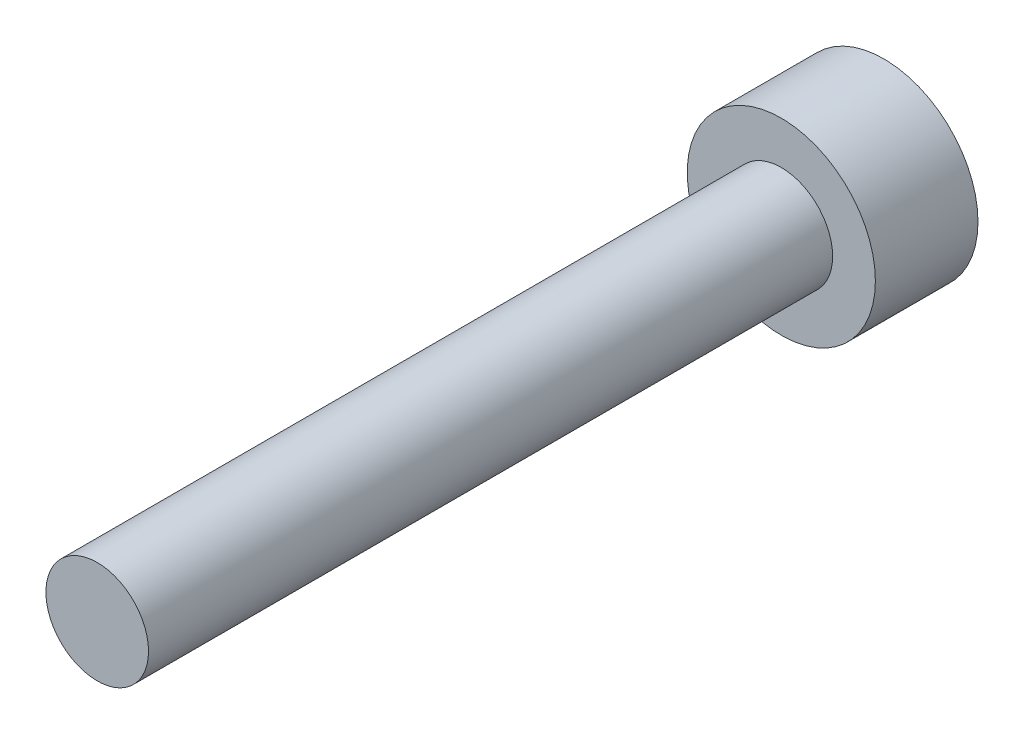
ISO-10303-21;
HEADER;
FILE_DESCRIPTION(('STEP AP214'),'2;1');
FILE_NAME('part.step','',(''),(''),'','','');
FILE_SCHEMA(('AUTOMOTIVE_DESIGN { 1 0 10303 214 1 1 1 1 }'));
ENDSEC;
DATA;
#1=APPLICATION_CONTEXT('core data for automotive mechanical design processes');
#2=APPLICATION_PROTOCOL_DEFINITION('international standard','automotive_design',2000,#1);
#3=PRODUCT_CONTEXT('',#1,'mechanical');
#4=PRODUCT('Part','Part','',(#3));
#5=PRODUCT_RELATED_PRODUCT_CATEGORY('part','',(#4));
#6=PRODUCT_DEFINITION_FORMATION('','',#4);
#7=PRODUCT_DEFINITION_CONTEXT('part definition',#1,'design');
#8=PRODUCT_DEFINITION('design','',#6,#7);
#9=PRODUCT_DEFINITION_SHAPE('','',#8);
#10=(LENGTH_UNIT() NAMED_UNIT(*) SI_UNIT(.MILLI.,.METRE.));
#11=(NAMED_UNIT(*) PLANE_ANGLE_UNIT() SI_UNIT($,.RADIAN.));
#12=(NAMED_UNIT(*) SI_UNIT($,.STERADIAN.) SOLID_ANGLE_UNIT());
#13=UNCERTAINTY_MEASURE_WITH_UNIT(LENGTH_MEASURE(1.E-05),#10,'distance_accuracy_value','');
#14=(GEOMETRIC_REPRESENTATION_CONTEXT(3) GLOBAL_UNCERTAINTY_ASSIGNED_CONTEXT((#13)) GLOBAL_UNIT_ASSIGNED_CONTEXT((#10,
#11,#12)) REPRESENTATION_CONTEXT('',''));
#15=CARTESIAN_POINT('',(0.,0.,0.));
#16=DIRECTION('',(0.,0.,1.));
#17=DIRECTION('',(1.,0.,0.));
#18=AXIS2_PLACEMENT_3D('',#15,#16,#17);
#19=CARTESIAN_POINT('',(0.,0.,3.));
#20=DIRECTION('',(0.,0.,-1.));
#21=DIRECTION('',(-1.,0.,0.));
#22=AXIS2_PLACEMENT_3D('',#19,#20,#21);
#23=CYLINDRICAL_SURFACE('',#22,2.75);
#24=CARTESIAN_POINT('',(0.,0.,3.));
#25=DIRECTION('',(0.,0.,1.));
#26=DIRECTION('',(1.,0.,0.));
#27=AXIS2_PLACEMENT_3D('',#24,#25,#26);
#28=CIRCLE('',#27,2.75);
#29=CARTESIAN_POINT('',(2.75,0.,3.));
#30=VERTEX_POINT('',#29);
#31=EDGE_CURVE('E39',#30,#30,#28,.T.);
#32=ORIENTED_EDGE('',*,*,#31,.F.);
#33=EDGE_LOOP('',(#32));
#34=FACE_BOUND('',#33,.T.);
#35=CARTESIAN_POINT('',(0.,0.,0.));
#36=DIRECTION('',(0.,0.,1.));
#37=DIRECTION('',(1.,0.,0.));
#38=AXIS2_PLACEMENT_3D('',#35,#36,#37);
#39=CIRCLE('',#38,2.75);
#40=CARTESIAN_POINT('',(2.75,0.,0.));
#41=VERTEX_POINT('',#40);
#42=EDGE_CURVE('E35',#41,#41,#39,.T.);
#43=ORIENTED_EDGE('',*,*,#42,.T.);
#44=EDGE_LOOP('',(#43));
#45=FACE_BOUND('',#44,.T.);
#46=ADVANCED_FACE('F32',(#34,#45),#23,.T.);
#47=CARTESIAN_POINT('',(0.,0.,3.));
#48=DIRECTION('',(0.,0.,1.));
#49=DIRECTION('',(1.,0.,0.));
#50=AXIS2_PLACEMENT_3D('',#47,#48,#49);
#51=PLANE('',#50);
#52=CARTESIAN_POINT('',(0.,0.,3.));
#53=DIRECTION('',(0.,0.,1.));
#54=DIRECTION('',(1.,0.,0.));
#55=AXIS2_PLACEMENT_3D('',#52,#53,#54);
#56=CIRCLE('',#55,1.5);
#57=CARTESIAN_POINT('',(1.5,0.,3.));
#58=VERTEX_POINT('',#57);
#59=EDGE_CURVE('E10',#58,#58,#56,.T.);
#60=ORIENTED_EDGE('',*,*,#59,.F.);
#61=EDGE_LOOP('',(#60));
#62=FACE_BOUND('',#61,.T.);
#63=ORIENTED_EDGE('',*,*,#31,.T.);
#64=EDGE_LOOP('',(#63));
#65=FACE_BOUND('',#64,.T.);
#66=ADVANCED_FACE('F56',(#62,#65),#51,.T.);
#67=CARTESIAN_POINT('',(0.,0.,0.));
#68=DIRECTION('',(0.,0.,1.));
#69=DIRECTION('',(1.,0.,0.));
#70=AXIS2_PLACEMENT_3D('',#67,#68,#69);
#71=PLANE('',#70);
#72=ORIENTED_EDGE('',*,*,#42,.F.);
#73=EDGE_LOOP('',(#72));
#74=FACE_BOUND('',#73,.T.);
#75=ADVANCED_FACE('F53',(#74),#71,.F.);
#76=CARTESIAN_POINT('',(0.,0.,23.));
#77=DIRECTION('',(0.,0.,-1.));
#78=DIRECTION('',(-1.,0.,0.));
#79=AXIS2_PLACEMENT_3D('',#76,#77,#78);
#80=CYLINDRICAL_SURFACE('',#79,1.5);
#81=CARTESIAN_POINT('',(0.,0.,23.));
#82=DIRECTION('',(0.,0.,1.));
#83=DIRECTION('',(1.,0.,0.));
#84=AXIS2_PLACEMENT_3D('',#81,#82,#83);
#85=CIRCLE('',#84,1.5);
#86=CARTESIAN_POINT('',(1.5,0.,23.));
#87=VERTEX_POINT('',#86);
#88=EDGE_CURVE('E45',#87,#87,#85,.T.);
#89=ORIENTED_EDGE('',*,*,#88,.F.);
#90=EDGE_LOOP('',(#89));
#91=FACE_BOUND('',#90,.T.);
#92=ORIENTED_EDGE('',*,*,#59,.T.);
#93=EDGE_LOOP('',(#92));
#94=FACE_BOUND('',#93,.T.);
#95=ADVANCED_FACE('F55',(#91,#94),#80,.T.);
#96=CARTESIAN_POINT('',(0.,0.,23.));
#97=DIRECTION('',(0.,0.,1.));
#98=DIRECTION('',(1.,0.,0.));
#99=AXIS2_PLACEMENT_3D('',#96,#97,#98);
#100=PLANE('',#99);
#101=ORIENTED_EDGE('',*,*,#88,.T.);
#102=EDGE_LOOP('',(#101));
#103=FACE_BOUND('',#102,.T.);
#104=ADVANCED_FACE('F61',(#103),#100,.T.);
#105=CLOSED_SHELL('',(#46,#66,#75,#95,#104));
#106=MANIFOLD_SOLID_BREP('B2',#105);
#107=ADVANCED_BREP_SHAPE_REPRESENTATION('',(#18,#106),#14);
#108=SHAPE_DEFINITION_REPRESENTATION(#9,#107);
ENDSEC;
END-ISO-10303-21;
